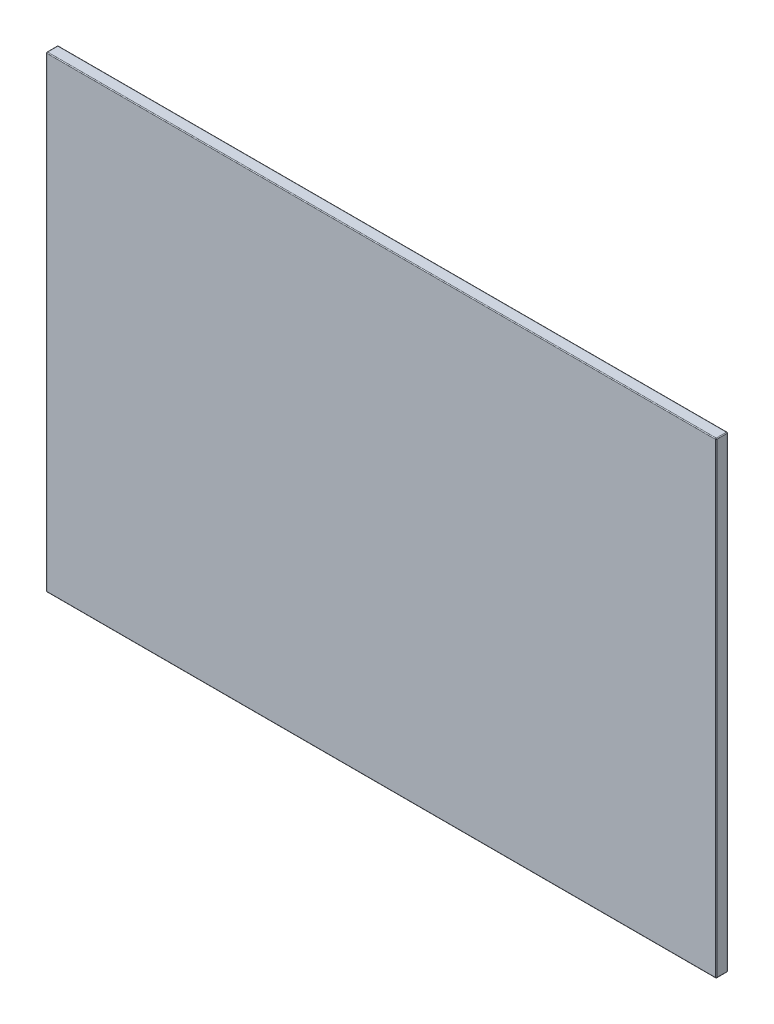
ISO-10303-21;
HEADER;
FILE_DESCRIPTION(('STEP AP214'),'2;1');
FILE_NAME('part.step','',(''),(''),'','','');
FILE_SCHEMA(('AUTOMOTIVE_DESIGN { 1 0 10303 214 1 1 1 1 }'));
ENDSEC;
DATA;
#1=APPLICATION_CONTEXT('core data for automotive mechanical design processes');
#2=APPLICATION_PROTOCOL_DEFINITION('international standard','automotive_design',2000,#1);
#3=PRODUCT_CONTEXT('',#1,'mechanical');
#4=PRODUCT('Part','Part','',(#3));
#5=PRODUCT_RELATED_PRODUCT_CATEGORY('part','',(#4));
#6=PRODUCT_DEFINITION_FORMATION('','',#4);
#7=PRODUCT_DEFINITION_CONTEXT('part definition',#1,'design');
#8=PRODUCT_DEFINITION('design','',#6,#7);
#9=PRODUCT_DEFINITION_SHAPE('','',#8);
#10=(LENGTH_UNIT() NAMED_UNIT(*) SI_UNIT(.MILLI.,.METRE.));
#11=(NAMED_UNIT(*) PLANE_ANGLE_UNIT() SI_UNIT($,.RADIAN.));
#12=(NAMED_UNIT(*) SI_UNIT($,.STERADIAN.) SOLID_ANGLE_UNIT());
#13=UNCERTAINTY_MEASURE_WITH_UNIT(LENGTH_MEASURE(1.E-05),#10,'distance_accuracy_value','');
#14=(GEOMETRIC_REPRESENTATION_CONTEXT(3) GLOBAL_UNCERTAINTY_ASSIGNED_CONTEXT((#13)) GLOBAL_UNIT_ASSIGNED_CONTEXT((#10,
#11,#12)) REPRESENTATION_CONTEXT('',''));
#15=CARTESIAN_POINT('',(0.,0.,0.));
#16=DIRECTION('',(0.,0.,1.));
#17=DIRECTION('',(1.,0.,0.));
#18=AXIS2_PLACEMENT_3D('',#15,#16,#17);
#19=CARTESIAN_POINT('',(-430.,300.,15.));
#20=DIRECTION('',(1.,0.,0.));
#21=DIRECTION('',(0.,0.,-1.));
#22=AXIS2_PLACEMENT_3D('',#19,#20,#21);
#23=PLANE('',#22);
#24=DIRECTION('',(0.,0.,-1.));
#25=VECTOR('',#24,1.);
#26=CARTESIAN_POINT('',(-430.,-300.,15.));
#27=LINE('',#26,#25);
#28=CARTESIAN_POINT('',(-430.,-300.,14.));
#29=VERTEX_POINT('',#28);
#30=CARTESIAN_POINT('',(-430.,-300.,1.));
#31=VERTEX_POINT('',#30);
#32=EDGE_CURVE('E159',#29,#31,#27,.T.);
#33=ORIENTED_EDGE('',*,*,#32,.F.);
#34=DIRECTION('',(0.,-1.,0.));
#35=VECTOR('',#34,1.);
#36=CARTESIAN_POINT('',(-430.,300.,14.));
#37=LINE('',#36,#35);
#38=CARTESIAN_POINT('',(-430.,299.,14.));
#39=VERTEX_POINT('',#38);
#40=EDGE_CURVE('E211',#29,#39,#37,.F.);
#41=ORIENTED_EDGE('',*,*,#40,.T.);
#42=DIRECTION('',(0.,0.,-1.));
#43=VECTOR('',#42,1.);
#44=CARTESIAN_POINT('',(-430.,299.,15.));
#45=LINE('',#44,#43);
#46=CARTESIAN_POINT('',(-430.,299.,1.));
#47=VERTEX_POINT('',#46);
#48=EDGE_CURVE('E208',#39,#47,#45,.T.);
#49=ORIENTED_EDGE('',*,*,#48,.T.);
#50=DIRECTION('',(0.,-1.,0.));
#51=VECTOR('',#50,1.);
#52=CARTESIAN_POINT('',(-430.,300.,1.));
#53=LINE('',#52,#51);
#54=EDGE_CURVE('E205',#47,#31,#53,.T.);
#55=ORIENTED_EDGE('',*,*,#54,.T.);
#56=EDGE_LOOP('',(#33,#41,#49,#55));
#57=FACE_BOUND('',#56,.T.);
#58=ADVANCED_FACE('F43',(#57),#23,.F.);
#59=CARTESIAN_POINT('',(-430.,-300.,15.));
#60=DIRECTION('',(0.,1.,0.));
#61=DIRECTION('',(0.,0.,1.));
#62=AXIS2_PLACEMENT_3D('',#59,#60,#61);
#63=PLANE('',#62);
#64=DIRECTION('',(0.,0.,-1.));
#65=VECTOR('',#64,1.);
#66=CARTESIAN_POINT('',(429.,-300.,15.));
#67=LINE('',#66,#65);
#68=CARTESIAN_POINT('',(429.,-300.,1.));
#69=VERTEX_POINT('',#68);
#70=CARTESIAN_POINT('',(429.,-300.,14.));
#71=VERTEX_POINT('',#70);
#72=EDGE_CURVE('E198',#69,#71,#67,.F.);
#73=ORIENTED_EDGE('',*,*,#72,.T.);
#74=DIRECTION('',(1.,0.,0.));
#75=VECTOR('',#74,1.);
#76=CARTESIAN_POINT('',(-430.,-300.,14.));
#77=LINE('',#76,#75);
#78=EDGE_CURVE('E201',#71,#29,#77,.F.);
#79=ORIENTED_EDGE('',*,*,#78,.T.);
#80=ORIENTED_EDGE('',*,*,#32,.T.);
#81=DIRECTION('',(1.,0.,0.));
#82=VECTOR('',#81,1.);
#83=CARTESIAN_POINT('',(-430.,-300.,1.));
#84=LINE('',#83,#82);
#85=EDGE_CURVE('E195',#31,#69,#84,.T.);
#86=ORIENTED_EDGE('',*,*,#85,.T.);
#87=EDGE_LOOP('',(#73,#79,#80,#86));
#88=FACE_BOUND('',#87,.T.);
#89=ADVANCED_FACE('F346',(#88),#63,.F.);
#90=CARTESIAN_POINT('',(430.,300.,15.));
#91=DIRECTION('',(-1.,0.,0.));
#92=DIRECTION('',(0.,0.,1.));
#93=AXIS2_PLACEMENT_3D('',#90,#91,#92);
#94=PLANE('',#93);
#95=DIRECTION('',(0.,0.,-1.));
#96=VECTOR('',#95,1.);
#97=CARTESIAN_POINT('',(430.,299.,15.));
#98=LINE('',#97,#96);
#99=CARTESIAN_POINT('',(430.,299.,1.));
#100=VERTEX_POINT('',#99);
#101=CARTESIAN_POINT('',(430.,299.,14.));
#102=VERTEX_POINT('',#101);
#103=EDGE_CURVE('E182',#100,#102,#98,.F.);
#104=ORIENTED_EDGE('',*,*,#103,.T.);
#105=DIRECTION('',(0.,1.,0.));
#106=VECTOR('',#105,1.);
#107=CARTESIAN_POINT('',(430.,-300.,14.));
#108=LINE('',#107,#106);
#109=CARTESIAN_POINT('',(430.,-299.,14.));
#110=VERTEX_POINT('',#109);
#111=EDGE_CURVE('E191',#102,#110,#108,.F.);
#112=ORIENTED_EDGE('',*,*,#111,.T.);
#113=DIRECTION('',(0.,0.,-1.));
#114=VECTOR('',#113,1.);
#115=CARTESIAN_POINT('',(430.,-299.,15.));
#116=LINE('',#115,#114);
#117=CARTESIAN_POINT('',(430.,-299.,1.));
#118=VERTEX_POINT('',#117);
#119=EDGE_CURVE('E188',#110,#118,#116,.T.);
#120=ORIENTED_EDGE('',*,*,#119,.T.);
#121=DIRECTION('',(0.,1.,0.));
#122=VECTOR('',#121,1.);
#123=CARTESIAN_POINT('',(430.,300.,1.));
#124=LINE('',#123,#122);
#125=EDGE_CURVE('E185',#118,#100,#124,.T.);
#126=ORIENTED_EDGE('',*,*,#125,.T.);
#127=EDGE_LOOP('',(#104,#112,#120,#126));
#128=FACE_BOUND('',#127,.T.);
#129=ADVANCED_FACE('F351',(#128),#94,.F.);
#130=CARTESIAN_POINT('',(-430.,300.,15.));
#131=DIRECTION('',(0.,-1.,0.));
#132=DIRECTION('',(0.,0.,-1.));
#133=AXIS2_PLACEMENT_3D('',#130,#131,#132);
#134=PLANE('',#133);
#135=DIRECTION('',(0.,0.,-1.));
#136=VECTOR('',#135,1.);
#137=CARTESIAN_POINT('',(-429.,300.,15.));
#138=LINE('',#137,#136);
#139=CARTESIAN_POINT('',(-429.,300.,1.));
#140=VERTEX_POINT('',#139);
#141=CARTESIAN_POINT('',(-429.,300.,14.));
#142=VERTEX_POINT('',#141);
#143=EDGE_CURVE('E177',#140,#142,#138,.F.);
#144=ORIENTED_EDGE('',*,*,#143,.T.);
#145=DIRECTION('',(-1.,0.,0.));
#146=VECTOR('',#145,1.);
#147=CARTESIAN_POINT('',(430.,300.,14.));
#148=LINE('',#147,#146);
#149=CARTESIAN_POINT('',(429.,300.,14.));
#150=VERTEX_POINT('',#149);
#151=EDGE_CURVE('E134',#142,#150,#148,.F.);
#152=ORIENTED_EDGE('',*,*,#151,.T.);
#153=DIRECTION('',(0.,0.,-1.));
#154=VECTOR('',#153,1.);
#155=CARTESIAN_POINT('',(429.,300.,15.));
#156=LINE('',#155,#154);
#157=CARTESIAN_POINT('',(429.,300.,1.));
#158=VERTEX_POINT('',#157);
#159=EDGE_CURVE('E166',#150,#158,#156,.T.);
#160=ORIENTED_EDGE('',*,*,#159,.T.);
#161=DIRECTION('',(-1.,0.,0.));
#162=VECTOR('',#161,1.);
#163=CARTESIAN_POINT('',(-430.,300.,1.));
#164=LINE('',#163,#162);
#165=EDGE_CURVE('E170',#158,#140,#164,.T.);
#166=ORIENTED_EDGE('',*,*,#165,.T.);
#167=EDGE_LOOP('',(#144,#152,#160,#166));
#168=FACE_BOUND('',#167,.T.);
#169=ADVANCED_FACE('F315',(#168),#134,.F.);
#170=CARTESIAN_POINT('',(0.,0.,15.));
#171=DIRECTION('',(0.,0.,1.));
#172=DIRECTION('',(1.,0.,0.));
#173=AXIS2_PLACEMENT_3D('',#170,#171,#172);
#174=PLANE('',#173);
#175=DIRECTION('',(0.,1.,0.));
#176=VECTOR('',#175,1.);
#177=CARTESIAN_POINT('',(429.,300.,15.));
#178=LINE('',#177,#176);
#179=CARTESIAN_POINT('',(429.,-299.,15.));
#180=VERTEX_POINT('',#179);
#181=CARTESIAN_POINT('',(429.,299.,15.));
#182=VERTEX_POINT('',#181);
#183=EDGE_CURVE('E163',#180,#182,#178,.T.);
#184=ORIENTED_EDGE('',*,*,#183,.T.);
#185=DIRECTION('',(-1.,0.,0.));
#186=VECTOR('',#185,1.);
#187=CARTESIAN_POINT('',(-430.,299.,15.));
#188=LINE('',#187,#186);
#189=CARTESIAN_POINT('',(-429.,299.,15.));
#190=VERTEX_POINT('',#189);
#191=EDGE_CURVE('E132',#182,#190,#188,.T.);
#192=ORIENTED_EDGE('',*,*,#191,.T.);
#193=DIRECTION('',(0.,-1.,0.));
#194=VECTOR('',#193,1.);
#195=CARTESIAN_POINT('',(-429.,-300.,15.));
#196=LINE('',#195,#194);
#197=CARTESIAN_POINT('',(-429.,-299.,15.));
#198=VERTEX_POINT('',#197);
#199=EDGE_CURVE('E151',#190,#198,#196,.T.);
#200=ORIENTED_EDGE('',*,*,#199,.T.);
#201=DIRECTION('',(1.,0.,0.));
#202=VECTOR('',#201,1.);
#203=CARTESIAN_POINT('',(430.,-299.,15.));
#204=LINE('',#203,#202);
#205=EDGE_CURVE('E158',#198,#180,#204,.T.);
#206=ORIENTED_EDGE('',*,*,#205,.T.);
#207=EDGE_LOOP('',(#184,#192,#200,#206));
#208=FACE_BOUND('',#207,.T.);
#209=ADVANCED_FACE('F161',(#208),#174,.T.);
#210=CARTESIAN_POINT('',(0.,0.,0.));
#211=DIRECTION('',(0.,0.,1.));
#212=DIRECTION('',(1.,0.,0.));
#213=AXIS2_PLACEMENT_3D('',#210,#211,#212);
#214=PLANE('',#213);
#215=DIRECTION('',(1.,0.,0.));
#216=VECTOR('',#215,1.);
#217=CARTESIAN_POINT('',(0.,-299.,0.));
#218=LINE('',#217,#216);
#219=CARTESIAN_POINT('',(429.,-299.,0.));
#220=VERTEX_POINT('',#219);
#221=CARTESIAN_POINT('',(-429.,-299.,0.));
#222=VERTEX_POINT('',#221);
#223=EDGE_CURVE('E53',#220,#222,#218,.F.);
#224=ORIENTED_EDGE('',*,*,#223,.T.);
#225=DIRECTION('',(0.,-1.,0.));
#226=VECTOR('',#225,1.);
#227=CARTESIAN_POINT('',(-429.,0.,0.));
#228=LINE('',#227,#226);
#229=CARTESIAN_POINT('',(-429.,299.,0.));
#230=VERTEX_POINT('',#229);
#231=EDGE_CURVE('E11',#222,#230,#228,.F.);
#232=ORIENTED_EDGE('',*,*,#231,.T.);
#233=DIRECTION('',(-1.,0.,0.));
#234=VECTOR('',#233,1.);
#235=CARTESIAN_POINT('',(0.,299.,0.));
#236=LINE('',#235,#234);
#237=CARTESIAN_POINT('',(429.,299.,0.));
#238=VERTEX_POINT('',#237);
#239=EDGE_CURVE('E214',#230,#238,#236,.F.);
#240=ORIENTED_EDGE('',*,*,#239,.T.);
#241=DIRECTION('',(0.,1.,0.));
#242=VECTOR('',#241,1.);
#243=CARTESIAN_POINT('',(429.,0.,0.));
#244=LINE('',#243,#242);
#245=EDGE_CURVE('E64',#238,#220,#244,.F.);
#246=ORIENTED_EDGE('',*,*,#245,.T.);
#247=EDGE_LOOP('',(#224,#232,#240,#246));
#248=FACE_BOUND('',#247,.T.);
#249=ADVANCED_FACE('F334',(#248),#214,.F.);
#250=CARTESIAN_POINT('',(429.,-299.,1.));
#251=DIRECTION('',(0.,0.,-1.));
#252=DIRECTION('',(-1.,0.,0.));
#253=AXIS2_PLACEMENT_3D('',#250,#251,#252);
#254=SPHERICAL_SURFACE('',#253,1.);
#255=CARTESIAN_POINT('',(429.,-299.,1.));
#256=DIRECTION('',(0.,0.,-1.));
#257=DIRECTION('',(-1.,0.,0.));
#258=AXIS2_PLACEMENT_3D('',#255,#256,#257);
#259=CIRCLE('',#258,1.);
#260=EDGE_CURVE('E272',#69,#118,#259,.F.);
#261=ORIENTED_EDGE('',*,*,#260,.F.);
#262=CARTESIAN_POINT('',(429.,-299.,1.));
#263=DIRECTION('',(1.,0.,0.));
#264=DIRECTION('',(0.,0.,-1.));
#265=AXIS2_PLACEMENT_3D('',#262,#263,#264);
#266=CIRCLE('',#265,1.);
#267=EDGE_CURVE('E47',#220,#69,#266,.F.);
#268=ORIENTED_EDGE('',*,*,#267,.F.);
#269=CARTESIAN_POINT('',(429.,-299.,1.));
#270=DIRECTION('',(0.,-1.,0.));
#271=DIRECTION('',(0.,0.,-1.));
#272=AXIS2_PLACEMENT_3D('',#269,#270,#271);
#273=CIRCLE('',#272,1.);
#274=EDGE_CURVE('E275',#118,#220,#273,.F.);
#275=ORIENTED_EDGE('',*,*,#274,.F.);
#276=EDGE_LOOP('',(#261,#268,#275));
#277=FACE_BOUND('',#276,.T.);
#278=ADVANCED_FACE('F45',(#277),#254,.T.);
#279=CARTESIAN_POINT('',(-430.,-299.,1.));
#280=DIRECTION('',(1.,0.,0.));
#281=DIRECTION('',(0.,0.,-1.));
#282=AXIS2_PLACEMENT_3D('',#279,#280,#281);
#283=CYLINDRICAL_SURFACE('',#282,1.);
#284=ORIENTED_EDGE('',*,*,#267,.T.);
#285=ORIENTED_EDGE('',*,*,#85,.F.);
#286=CARTESIAN_POINT('',(-429.,-299.,1.));
#287=DIRECTION('',(0.707106781186547,-0.707106781186547,0.));
#288=DIRECTION('',(0.707106781186547,0.707106781186547,0.));
#289=AXIS2_PLACEMENT_3D('',#286,#287,#288);
#290=ELLIPSE('',#289,1.41421356237309,1.);
#291=EDGE_CURVE('E268',#222,#31,#290,.F.);
#292=ORIENTED_EDGE('',*,*,#291,.F.);
#293=ORIENTED_EDGE('',*,*,#223,.F.);
#294=EDGE_LOOP('',(#284,#285,#292,#293));
#295=FACE_BOUND('',#294,.T.);
#296=ADVANCED_FACE('F341',(#295),#283,.T.);
#297=CARTESIAN_POINT('',(429.,300.,1.));
#298=DIRECTION('',(0.,1.,0.));
#299=DIRECTION('',(0.,0.,1.));
#300=AXIS2_PLACEMENT_3D('',#297,#298,#299);
#301=CYLINDRICAL_SURFACE('',#300,1.);
#302=ORIENTED_EDGE('',*,*,#274,.T.);
#303=ORIENTED_EDGE('',*,*,#245,.F.);
#304=CARTESIAN_POINT('',(429.,299.,1.));
#305=DIRECTION('',(0.,1.,0.));
#306=DIRECTION('',(0.,0.,1.));
#307=AXIS2_PLACEMENT_3D('',#304,#305,#306);
#308=CIRCLE('',#307,1.);
#309=EDGE_CURVE('E260',#100,#238,#308,.T.);
#310=ORIENTED_EDGE('',*,*,#309,.F.);
#311=ORIENTED_EDGE('',*,*,#125,.F.);
#312=EDGE_LOOP('',(#302,#303,#310,#311));
#313=FACE_BOUND('',#312,.T.);
#314=ADVANCED_FACE('F386',(#313),#301,.T.);
#315=CARTESIAN_POINT('',(429.,-299.,15.));
#316=DIRECTION('',(0.,0.,-1.));
#317=DIRECTION('',(-1.,0.,0.));
#318=AXIS2_PLACEMENT_3D('',#315,#316,#317);
#319=CYLINDRICAL_SURFACE('',#318,1.);
#320=ORIENTED_EDGE('',*,*,#260,.T.);
#321=ORIENTED_EDGE('',*,*,#119,.F.);
#322=CARTESIAN_POINT('',(429.,-299.,14.));
#323=DIRECTION('',(0.,0.,1.));
#324=DIRECTION('',(1.,0.,0.));
#325=AXIS2_PLACEMENT_3D('',#322,#323,#324);
#326=CIRCLE('',#325,1.);
#327=EDGE_CURVE('E256',#71,#110,#326,.T.);
#328=ORIENTED_EDGE('',*,*,#327,.F.);
#329=ORIENTED_EDGE('',*,*,#72,.F.);
#330=EDGE_LOOP('',(#320,#321,#328,#329));
#331=FACE_BOUND('',#330,.T.);
#332=ADVANCED_FACE('F383',(#331),#319,.T.);
#333=CARTESIAN_POINT('',(-429.,300.,1.));
#334=DIRECTION('',(0.,-1.,0.));
#335=DIRECTION('',(0.,0.,-1.));
#336=AXIS2_PLACEMENT_3D('',#333,#334,#335);
#337=CYLINDRICAL_SURFACE('',#336,1.);
#338=ORIENTED_EDGE('',*,*,#291,.T.);
#339=ORIENTED_EDGE('',*,*,#54,.F.);
#340=CARTESIAN_POINT('',(-429.,299.,1.));
#341=DIRECTION('',(0.,1.,0.));
#342=DIRECTION('',(0.,0.,1.));
#343=AXIS2_PLACEMENT_3D('',#340,#341,#342);
#344=CIRCLE('',#343,1.);
#345=EDGE_CURVE('E248',#230,#47,#344,.T.);
#346=ORIENTED_EDGE('',*,*,#345,.F.);
#347=ORIENTED_EDGE('',*,*,#231,.F.);
#348=EDGE_LOOP('',(#338,#339,#346,#347));
#349=FACE_BOUND('',#348,.T.);
#350=ADVANCED_FACE('F326',(#349),#337,.T.);
#351=CARTESIAN_POINT('',(-430.,299.,1.));
#352=DIRECTION('',(-1.,0.,0.));
#353=DIRECTION('',(0.,0.,1.));
#354=AXIS2_PLACEMENT_3D('',#351,#352,#353);
#355=CYLINDRICAL_SURFACE('',#354,1.);
#356=CARTESIAN_POINT('',(429.,299.,1.));
#357=DIRECTION('',(1.,0.,0.));
#358=DIRECTION('',(0.,0.,-1.));
#359=AXIS2_PLACEMENT_3D('',#356,#357,#358);
#360=CIRCLE('',#359,1.);
#361=EDGE_CURVE('E264',#238,#158,#360,.T.);
#362=ORIENTED_EDGE('',*,*,#361,.F.);
#363=ORIENTED_EDGE('',*,*,#239,.F.);
#364=CARTESIAN_POINT('',(-429.,299.,1.));
#365=DIRECTION('',(-1.,0.,0.));
#366=DIRECTION('',(0.,0.,1.));
#367=AXIS2_PLACEMENT_3D('',#364,#365,#366);
#368=CIRCLE('',#367,1.);
#369=EDGE_CURVE('E245',#140,#230,#368,.T.);
#370=ORIENTED_EDGE('',*,*,#369,.F.);
#371=ORIENTED_EDGE('',*,*,#165,.F.);
#372=EDGE_LOOP('',(#362,#363,#370,#371));
#373=FACE_BOUND('',#372,.T.);
#374=ADVANCED_FACE('F333',(#373),#355,.T.);
#375=CARTESIAN_POINT('',(429.,299.,1.));
#376=DIRECTION('',(0.,0.,-1.));
#377=DIRECTION('',(-1.,0.,0.));
#378=AXIS2_PLACEMENT_3D('',#375,#376,#377);
#379=SPHERICAL_SURFACE('',#378,1.);
#380=ORIENTED_EDGE('',*,*,#309,.T.);
#381=ORIENTED_EDGE('',*,*,#361,.T.);
#382=CARTESIAN_POINT('',(429.,299.,1.));
#383=DIRECTION('',(0.,0.,-1.));
#384=DIRECTION('',(-1.,0.,0.));
#385=AXIS2_PLACEMENT_3D('',#382,#383,#384);
#386=CIRCLE('',#385,1.);
#387=EDGE_CURVE('E241',#100,#158,#386,.F.);
#388=ORIENTED_EDGE('',*,*,#387,.F.);
#389=EDGE_LOOP('',(#380,#381,#388));
#390=FACE_BOUND('',#389,.T.);
#391=ADVANCED_FACE('F375',(#390),#379,.T.);
#392=CARTESIAN_POINT('',(429.,-299.,14.));
#393=DIRECTION('',(0.,-1.,0.));
#394=DIRECTION('',(0.,0.,-1.));
#395=AXIS2_PLACEMENT_3D('',#392,#393,#394);
#396=SPHERICAL_SURFACE('',#395,1.);
#397=CARTESIAN_POINT('',(429.,-299.,14.));
#398=DIRECTION('',(0.,-1.,0.));
#399=DIRECTION('',(0.,0.,-1.));
#400=AXIS2_PLACEMENT_3D('',#397,#398,#399);
#401=CIRCLE('',#400,1.);
#402=EDGE_CURVE('E238',#180,#110,#401,.F.);
#403=ORIENTED_EDGE('',*,*,#402,.F.);
#404=CARTESIAN_POINT('',(429.,-299.,14.));
#405=DIRECTION('',(1.,0.,0.));
#406=DIRECTION('',(0.,0.,-1.));
#407=AXIS2_PLACEMENT_3D('',#404,#405,#406);
#408=CIRCLE('',#407,1.);
#409=EDGE_CURVE('E252',#71,#180,#408,.F.);
#410=ORIENTED_EDGE('',*,*,#409,.F.);
#411=ORIENTED_EDGE('',*,*,#327,.T.);
#412=EDGE_LOOP('',(#403,#410,#411));
#413=FACE_BOUND('',#412,.T.);
#414=ADVANCED_FACE('F298',(#413),#396,.T.);
#415=CARTESIAN_POINT('',(0.,-299.,14.));
#416=DIRECTION('',(-1.,0.,0.));
#417=DIRECTION('',(0.,0.,1.));
#418=AXIS2_PLACEMENT_3D('',#415,#416,#417);
#419=CYLINDRICAL_SURFACE('',#418,1.);
#420=ORIENTED_EDGE('',*,*,#409,.T.);
#421=ORIENTED_EDGE('',*,*,#205,.F.);
#422=CARTESIAN_POINT('',(-429.,-299.,14.));
#423=DIRECTION('',(-0.707106781186547,0.707106781186547,0.));
#424=DIRECTION('',(0.707106781186547,0.707106781186547,0.));
#425=AXIS2_PLACEMENT_3D('',#422,#423,#424);
#426=ELLIPSE('',#425,1.41421356237309,1.);
#427=EDGE_CURVE('E154',#29,#198,#426,.T.);
#428=ORIENTED_EDGE('',*,*,#427,.F.);
#429=ORIENTED_EDGE('',*,*,#78,.F.);
#430=EDGE_LOOP('',(#420,#421,#428,#429));
#431=FACE_BOUND('',#430,.T.);
#432=ADVANCED_FACE('F296',(#431),#419,.T.);
#433=CARTESIAN_POINT('',(-429.,299.,1.));
#434=DIRECTION('',(0.,0.,-1.));
#435=DIRECTION('',(-1.,0.,0.));
#436=AXIS2_PLACEMENT_3D('',#433,#434,#435);
#437=SPHERICAL_SURFACE('',#436,1.);
#438=ORIENTED_EDGE('',*,*,#369,.T.);
#439=ORIENTED_EDGE('',*,*,#345,.T.);
#440=CARTESIAN_POINT('',(-429.,299.,1.));
#441=DIRECTION('',(0.,0.,-1.));
#442=DIRECTION('',(-1.,0.,0.));
#443=AXIS2_PLACEMENT_3D('',#440,#441,#442);
#444=CIRCLE('',#443,1.);
#445=EDGE_CURVE('E232',#140,#47,#444,.F.);
#446=ORIENTED_EDGE('',*,*,#445,.F.);
#447=EDGE_LOOP('',(#438,#439,#446));
#448=FACE_BOUND('',#447,.T.);
#449=ADVANCED_FACE('F330',(#448),#437,.T.);
#450=CARTESIAN_POINT('',(429.,299.,15.));
#451=DIRECTION('',(0.,0.,-1.));
#452=DIRECTION('',(-1.,0.,0.));
#453=AXIS2_PLACEMENT_3D('',#450,#451,#452);
#454=CYLINDRICAL_SURFACE('',#453,1.);
#455=ORIENTED_EDGE('',*,*,#387,.T.);
#456=ORIENTED_EDGE('',*,*,#159,.F.);
#457=CARTESIAN_POINT('',(429.,299.,14.));
#458=DIRECTION('',(0.,0.,1.));
#459=DIRECTION('',(1.,0.,0.));
#460=AXIS2_PLACEMENT_3D('',#457,#458,#459);
#461=CIRCLE('',#460,1.);
#462=EDGE_CURVE('E228',#102,#150,#461,.T.);
#463=ORIENTED_EDGE('',*,*,#462,.F.);
#464=ORIENTED_EDGE('',*,*,#103,.F.);
#465=EDGE_LOOP('',(#455,#456,#463,#464));
#466=FACE_BOUND('',#465,.T.);
#467=ADVANCED_FACE('F311',(#466),#454,.T.);
#468=CARTESIAN_POINT('',(429.,0.,14.));
#469=DIRECTION('',(0.,-1.,0.));
#470=DIRECTION('',(0.,0.,-1.));
#471=AXIS2_PLACEMENT_3D('',#468,#469,#470);
#472=CYLINDRICAL_SURFACE('',#471,1.);
#473=ORIENTED_EDGE('',*,*,#402,.T.);
#474=ORIENTED_EDGE('',*,*,#111,.F.);
#475=CARTESIAN_POINT('',(429.,299.,14.));
#476=DIRECTION('',(0.,1.,0.));
#477=DIRECTION('',(0.,0.,1.));
#478=AXIS2_PLACEMENT_3D('',#475,#476,#477);
#479=CIRCLE('',#478,1.);
#480=EDGE_CURVE('E148',#182,#102,#479,.T.);
#481=ORIENTED_EDGE('',*,*,#480,.F.);
#482=ORIENTED_EDGE('',*,*,#183,.F.);
#483=EDGE_LOOP('',(#473,#474,#481,#482));
#484=FACE_BOUND('',#483,.T.);
#485=ADVANCED_FACE('F303',(#484),#472,.T.);
#486=CARTESIAN_POINT('',(-429.,0.,14.));
#487=DIRECTION('',(0.,1.,0.));
#488=DIRECTION('',(0.,0.,1.));
#489=AXIS2_PLACEMENT_3D('',#486,#487,#488);
#490=CYLINDRICAL_SURFACE('',#489,1.);
#491=ORIENTED_EDGE('',*,*,#427,.T.);
#492=ORIENTED_EDGE('',*,*,#199,.F.);
#493=CARTESIAN_POINT('',(-429.,299.,14.));
#494=DIRECTION('',(0.,1.,0.));
#495=DIRECTION('',(0.,0.,1.));
#496=AXIS2_PLACEMENT_3D('',#493,#494,#495);
#497=CIRCLE('',#496,1.);
#498=EDGE_CURVE('E141',#39,#190,#497,.T.);
#499=ORIENTED_EDGE('',*,*,#498,.F.);
#500=ORIENTED_EDGE('',*,*,#40,.F.);
#501=EDGE_LOOP('',(#491,#492,#499,#500));
#502=FACE_BOUND('',#501,.T.);
#503=ADVANCED_FACE('F152',(#502),#490,.T.);
#504=CARTESIAN_POINT('',(-429.,299.,15.));
#505=DIRECTION('',(0.,0.,-1.));
#506=DIRECTION('',(-1.,0.,0.));
#507=AXIS2_PLACEMENT_3D('',#504,#505,#506);
#508=CYLINDRICAL_SURFACE('',#507,1.);
#509=ORIENTED_EDGE('',*,*,#445,.T.);
#510=ORIENTED_EDGE('',*,*,#48,.F.);
#511=CARTESIAN_POINT('',(-429.,299.,14.));
#512=DIRECTION('',(0.,0.,1.));
#513=DIRECTION('',(1.,0.,0.));
#514=AXIS2_PLACEMENT_3D('',#511,#512,#513);
#515=CIRCLE('',#514,1.);
#516=EDGE_CURVE('E145',#142,#39,#515,.T.);
#517=ORIENTED_EDGE('',*,*,#516,.F.);
#518=ORIENTED_EDGE('',*,*,#143,.F.);
#519=EDGE_LOOP('',(#509,#510,#517,#518));
#520=FACE_BOUND('',#519,.T.);
#521=ADVANCED_FACE('F320',(#520),#508,.T.);
#522=CARTESIAN_POINT('',(429.,299.,14.));
#523=DIRECTION('',(1.,0.,0.));
#524=DIRECTION('',(0.,0.,-1.));
#525=AXIS2_PLACEMENT_3D('',#522,#523,#524);
#526=SPHERICAL_SURFACE('',#525,1.);
#527=ORIENTED_EDGE('',*,*,#480,.T.);
#528=ORIENTED_EDGE('',*,*,#462,.T.);
#529=CARTESIAN_POINT('',(429.,299.,14.));
#530=DIRECTION('',(1.,0.,0.));
#531=DIRECTION('',(0.,0.,-1.));
#532=AXIS2_PLACEMENT_3D('',#529,#530,#531);
#533=CIRCLE('',#532,1.);
#534=EDGE_CURVE('E138',#182,#150,#533,.F.);
#535=ORIENTED_EDGE('',*,*,#534,.F.);
#536=EDGE_LOOP('',(#527,#528,#535));
#537=FACE_BOUND('',#536,.T.);
#538=ADVANCED_FACE('F307',(#537),#526,.T.);
#539=CARTESIAN_POINT('',(-429.,299.,14.));
#540=DIRECTION('',(-1.,0.,0.));
#541=DIRECTION('',(0.,0.,1.));
#542=AXIS2_PLACEMENT_3D('',#539,#540,#541);
#543=SPHERICAL_SURFACE('',#542,1.);
#544=ORIENTED_EDGE('',*,*,#516,.T.);
#545=ORIENTED_EDGE('',*,*,#498,.T.);
#546=CARTESIAN_POINT('',(-429.,299.,14.));
#547=DIRECTION('',(-1.,0.,0.));
#548=DIRECTION('',(0.,0.,1.));
#549=AXIS2_PLACEMENT_3D('',#546,#547,#548);
#550=CIRCLE('',#549,1.);
#551=EDGE_CURVE('E128',#142,#190,#550,.F.);
#552=ORIENTED_EDGE('',*,*,#551,.F.);
#553=EDGE_LOOP('',(#544,#545,#552));
#554=FACE_BOUND('',#553,.T.);
#555=ADVANCED_FACE('F143',(#554),#543,.T.);
#556=CARTESIAN_POINT('',(0.,299.,14.));
#557=DIRECTION('',(1.,0.,0.));
#558=DIRECTION('',(0.,0.,-1.));
#559=AXIS2_PLACEMENT_3D('',#556,#557,#558);
#560=CYLINDRICAL_SURFACE('',#559,1.);
#561=ORIENTED_EDGE('',*,*,#534,.T.);
#562=ORIENTED_EDGE('',*,*,#151,.F.);
#563=ORIENTED_EDGE('',*,*,#551,.T.);
#564=ORIENTED_EDGE('',*,*,#191,.F.);
#565=EDGE_LOOP('',(#561,#562,#563,#564));
#566=FACE_BOUND('',#565,.T.);
#567=ADVANCED_FACE('F130',(#566),#560,.T.);
#568=CLOSED_SHELL('',(#58,#89,#129,#169,#209,#249,#278,#296,#314,#332,#350,#374,#391,#414,#432,
#449,#467,#485,#503,#521,#538,#555,#567));
#569=MANIFOLD_SOLID_BREP('B2',#568);
#570=ADVANCED_BREP_SHAPE_REPRESENTATION('',(#18,#569),#14);
#571=SHAPE_DEFINITION_REPRESENTATION(#9,#570);
ENDSEC;
END-ISO-10303-21;
